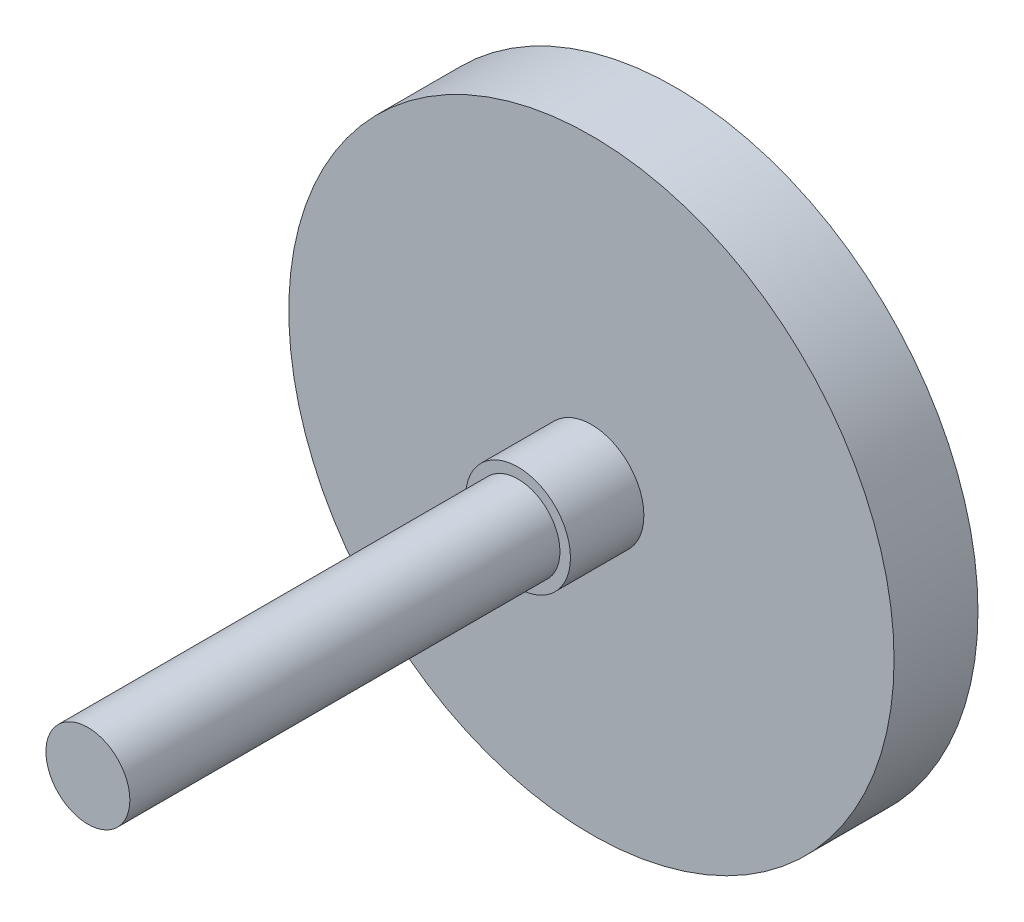
ISO-10303-21;
HEADER;
FILE_DESCRIPTION(('STEP AP214'),'2;1');
FILE_NAME('part.step','',(''),(''),'','','');
FILE_SCHEMA(('AUTOMOTIVE_DESIGN { 1 0 10303 214 1 1 1 1 }'));
ENDSEC;
DATA;
#1=APPLICATION_CONTEXT('core data for automotive mechanical design processes');
#2=APPLICATION_PROTOCOL_DEFINITION('international standard','automotive_design',2000,#1);
#3=PRODUCT_CONTEXT('',#1,'mechanical');
#4=PRODUCT('Part','Part','',(#3));
#5=PRODUCT_RELATED_PRODUCT_CATEGORY('part','',(#4));
#6=PRODUCT_DEFINITION_FORMATION('','',#4);
#7=PRODUCT_DEFINITION_CONTEXT('part definition',#1,'design');
#8=PRODUCT_DEFINITION('design','',#6,#7);
#9=PRODUCT_DEFINITION_SHAPE('','',#8);
#10=(LENGTH_UNIT() NAMED_UNIT(*) SI_UNIT(.MILLI.,.METRE.));
#11=(NAMED_UNIT(*) PLANE_ANGLE_UNIT() SI_UNIT($,.RADIAN.));
#12=(NAMED_UNIT(*) SI_UNIT($,.STERADIAN.) SOLID_ANGLE_UNIT());
#13=UNCERTAINTY_MEASURE_WITH_UNIT(LENGTH_MEASURE(1.E-05),#10,'distance_accuracy_value','');
#14=(GEOMETRIC_REPRESENTATION_CONTEXT(3) GLOBAL_UNCERTAINTY_ASSIGNED_CONTEXT((#13)) GLOBAL_UNIT_ASSIGNED_CONTEXT((#10,
#11,#12)) REPRESENTATION_CONTEXT('',''));
#15=CARTESIAN_POINT('',(0.,0.,0.));
#16=DIRECTION('',(0.,0.,1.));
#17=DIRECTION('',(1.,0.,0.));
#18=AXIS2_PLACEMENT_3D('',#15,#16,#17);
#19=CARTESIAN_POINT('',(0.,0.,8.));
#20=DIRECTION('',(0.,0.,-1.));
#21=DIRECTION('',(-1.,0.,0.));
#22=AXIS2_PLACEMENT_3D('',#19,#20,#21);
#23=CYLINDRICAL_SURFACE('',#22,28.85);
#24=CARTESIAN_POINT('',(0.,0.,8.));
#25=DIRECTION('',(0.,0.,1.));
#26=DIRECTION('',(1.,0.,0.));
#27=AXIS2_PLACEMENT_3D('',#24,#25,#26);
#28=CIRCLE('',#27,28.85);
#29=CARTESIAN_POINT('',(28.85,0.,8.));
#30=VERTEX_POINT('',#29);
#31=EDGE_CURVE('E42',#30,#30,#28,.T.);
#32=ORIENTED_EDGE('',*,*,#31,.F.);
#33=EDGE_LOOP('',(#32));
#34=FACE_BOUND('',#33,.T.);
#35=CARTESIAN_POINT('',(0.,0.,0.));
#36=DIRECTION('',(0.,0.,1.));
#37=DIRECTION('',(1.,0.,0.));
#38=AXIS2_PLACEMENT_3D('',#35,#36,#37);
#39=CIRCLE('',#38,28.85);
#40=CARTESIAN_POINT('',(28.85,0.,0.));
#41=VERTEX_POINT('',#40);
#42=EDGE_CURVE('E38',#41,#41,#39,.T.);
#43=ORIENTED_EDGE('',*,*,#42,.T.);
#44=EDGE_LOOP('',(#43));
#45=FACE_BOUND('',#44,.T.);
#46=ADVANCED_FACE('F35',(#34,#45),#23,.T.);
#47=CARTESIAN_POINT('',(0.,0.,8.));
#48=DIRECTION('',(0.,0.,1.));
#49=DIRECTION('',(1.,0.,0.));
#50=AXIS2_PLACEMENT_3D('',#47,#48,#49);
#51=PLANE('',#50);
#52=CARTESIAN_POINT('',(0.,0.,8.));
#53=DIRECTION('',(0.,0.,1.));
#54=DIRECTION('',(1.,0.,0.));
#55=AXIS2_PLACEMENT_3D('',#52,#53,#54);
#56=CIRCLE('',#55,5.);
#57=CARTESIAN_POINT('',(5.,0.,8.));
#58=VERTEX_POINT('',#57);
#59=EDGE_CURVE('E10',#58,#58,#56,.T.);
#60=ORIENTED_EDGE('',*,*,#59,.F.);
#61=EDGE_LOOP('',(#60));
#62=FACE_BOUND('',#61,.T.);
#63=ORIENTED_EDGE('',*,*,#31,.T.);
#64=EDGE_LOOP('',(#63));
#65=FACE_BOUND('',#64,.T.);
#66=ADVANCED_FACE('F86',(#62,#65),#51,.T.);
#67=CARTESIAN_POINT('',(0.,0.,0.));
#68=DIRECTION('',(0.,0.,1.));
#69=DIRECTION('',(1.,0.,0.));
#70=AXIS2_PLACEMENT_3D('',#67,#68,#69);
#71=PLANE('',#70);
#72=CARTESIAN_POINT('',(0.,0.,0.));
#73=DIRECTION('',(0.,0.,-1.));
#74=DIRECTION('',(-1.,0.,0.));
#75=AXIS2_PLACEMENT_3D('',#72,#73,#74);
#76=CIRCLE('',#75,4.);
#77=CARTESIAN_POINT('',(-4.,0.,0.));
#78=VERTEX_POINT('',#77);
#79=EDGE_CURVE('E54',#78,#78,#76,.T.);
#80=ORIENTED_EDGE('',*,*,#79,.F.);
#81=EDGE_LOOP('',(#80));
#82=FACE_BOUND('',#81,.T.);
#83=ORIENTED_EDGE('',*,*,#42,.F.);
#84=EDGE_LOOP('',(#83));
#85=FACE_BOUND('',#84,.T.);
#86=ADVANCED_FACE('F91',(#82,#85),#71,.F.);
#87=CARTESIAN_POINT('',(0.,0.,2.));
#88=DIRECTION('',(0.,0.,-1.));
#89=DIRECTION('',(-1.,0.,0.));
#90=AXIS2_PLACEMENT_3D('',#87,#88,#89);
#91=CYLINDRICAL_SURFACE('',#90,4.);
#92=CARTESIAN_POINT('',(0.,0.,2.));
#93=DIRECTION('',(0.,0.,-1.));
#94=DIRECTION('',(-1.,0.,0.));
#95=AXIS2_PLACEMENT_3D('',#92,#93,#94);
#96=CIRCLE('',#95,4.);
#97=CARTESIAN_POINT('',(-4.,0.,2.));
#98=VERTEX_POINT('',#97);
#99=EDGE_CURVE('E51',#98,#98,#96,.T.);
#100=ORIENTED_EDGE('',*,*,#99,.F.);
#101=EDGE_LOOP('',(#100));
#102=FACE_BOUND('',#101,.T.);
#103=ORIENTED_EDGE('',*,*,#79,.T.);
#104=EDGE_LOOP('',(#103));
#105=FACE_BOUND('',#104,.T.);
#106=ADVANCED_FACE('F100',(#102,#105),#91,.F.);
#107=CARTESIAN_POINT('',(0.,0.,2.));
#108=DIRECTION('',(0.,0.,-1.));
#109=DIRECTION('',(-1.,0.,0.));
#110=AXIS2_PLACEMENT_3D('',#107,#108,#109);
#111=PLANE('',#110);
#112=ORIENTED_EDGE('',*,*,#99,.T.);
#113=EDGE_LOOP('',(#112));
#114=FACE_BOUND('',#113,.T.);
#115=ADVANCED_FACE('F105',(#114),#111,.T.);
#116=CARTESIAN_POINT('',(0.,0.,15.));
#117=DIRECTION('',(0.,0.,1.));
#118=DIRECTION('',(1.,0.,0.));
#119=AXIS2_PLACEMENT_3D('',#116,#117,#118);
#120=PLANE('',#119);
#121=CARTESIAN_POINT('',(0.,0.,15.));
#122=DIRECTION('',(0.,0.,1.));
#123=DIRECTION('',(1.,0.,0.));
#124=AXIS2_PLACEMENT_3D('',#121,#122,#123);
#125=CIRCLE('',#124,5.);
#126=CARTESIAN_POINT('',(5.,0.,15.));
#127=VERTEX_POINT('',#126);
#128=EDGE_CURVE('E49',#127,#127,#125,.T.);
#129=ORIENTED_EDGE('',*,*,#128,.T.);
#130=EDGE_LOOP('',(#129));
#131=FACE_BOUND('',#130,.T.);
#132=CARTESIAN_POINT('',(0.,0.,15.));
#133=DIRECTION('',(0.,0.,1.));
#134=DIRECTION('',(1.,0.,0.));
#135=AXIS2_PLACEMENT_3D('',#132,#133,#134);
#136=CIRCLE('',#135,4.);
#137=CARTESIAN_POINT('',(4.,0.,15.));
#138=VERTEX_POINT('',#137);
#139=EDGE_CURVE('E59',#138,#138,#136,.T.);
#140=ORIENTED_EDGE('',*,*,#139,.F.);
#141=EDGE_LOOP('',(#140));
#142=FACE_BOUND('',#141,.T.);
#143=ADVANCED_FACE('F81',(#131,#142),#120,.T.);
#144=CARTESIAN_POINT('',(0.,0.,15.));
#145=DIRECTION('',(0.,0.,-1.));
#146=DIRECTION('',(-1.,0.,0.));
#147=AXIS2_PLACEMENT_3D('',#144,#145,#146);
#148=CYLINDRICAL_SURFACE('',#147,5.);
#149=ORIENTED_EDGE('',*,*,#128,.F.);
#150=EDGE_LOOP('',(#149));
#151=FACE_BOUND('',#150,.T.);
#152=ORIENTED_EDGE('',*,*,#59,.T.);
#153=EDGE_LOOP('',(#152));
#154=FACE_BOUND('',#153,.T.);
#155=ADVANCED_FACE('F74',(#151,#154),#148,.T.);
#156=CARTESIAN_POINT('',(0.,0.,56.));
#157=DIRECTION('',(0.,0.,-1.));
#158=DIRECTION('',(-1.,0.,0.));
#159=AXIS2_PLACEMENT_3D('',#156,#157,#158);
#160=CYLINDRICAL_SURFACE('',#159,4.);
#161=ORIENTED_EDGE('',*,*,#139,.T.);
#162=EDGE_LOOP('',(#161));
#163=FACE_BOUND('',#162,.T.);
#164=CARTESIAN_POINT('',(0.,0.,56.));
#165=DIRECTION('',(0.,0.,1.));
#166=DIRECTION('',(1.,0.,0.));
#167=AXIS2_PLACEMENT_3D('',#164,#165,#166);
#168=CIRCLE('',#167,4.);
#169=CARTESIAN_POINT('',(4.,0.,56.));
#170=VERTEX_POINT('',#169);
#171=EDGE_CURVE('E63',#170,#170,#168,.T.);
#172=ORIENTED_EDGE('',*,*,#171,.F.);
#173=EDGE_LOOP('',(#172));
#174=FACE_BOUND('',#173,.T.);
#175=ADVANCED_FACE('F72',(#163,#174),#160,.T.);
#176=CARTESIAN_POINT('',(0.,0.,56.));
#177=DIRECTION('',(0.,0.,1.));
#178=DIRECTION('',(1.,0.,0.));
#179=AXIS2_PLACEMENT_3D('',#176,#177,#178);
#180=PLANE('',#179);
#181=ORIENTED_EDGE('',*,*,#171,.T.);
#182=EDGE_LOOP('',(#181));
#183=FACE_BOUND('',#182,.T.);
#184=ADVANCED_FACE('F70',(#183),#180,.T.);
#185=CLOSED_SHELL('',(#46,#66,#86,#106,#115,#143,#155,#175,#184));
#186=MANIFOLD_SOLID_BREP('B2',#185);
#187=ADVANCED_BREP_SHAPE_REPRESENTATION('',(#18,#186),#14);
#188=SHAPE_DEFINITION_REPRESENTATION(#9,#187);
ENDSEC;
END-ISO-10303-21;
